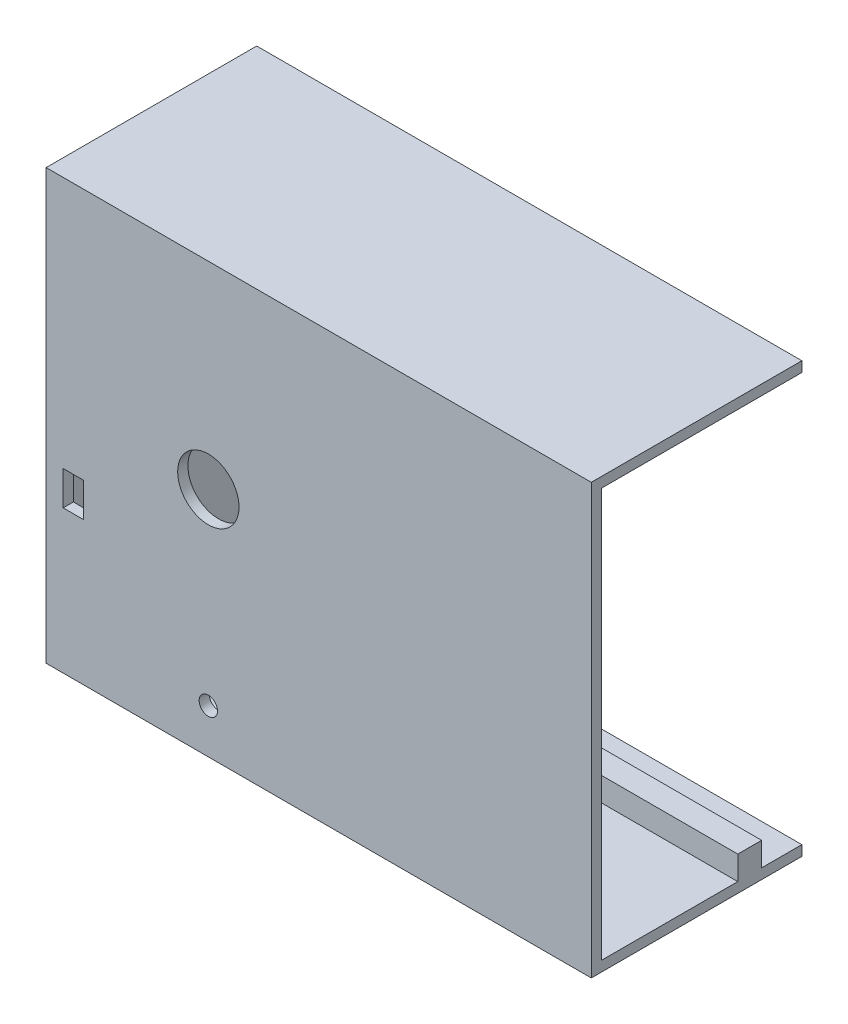
ISO-10303-21;
HEADER;
FILE_DESCRIPTION(('STEP AP214'),'2;1');
FILE_NAME('part.step','',(''),(''),'','','');
FILE_SCHEMA(('AUTOMOTIVE_DESIGN { 1 0 10303 214 1 1 1 1 }'));
ENDSEC;
DATA;
#1=APPLICATION_CONTEXT('core data for automotive mechanical design processes');
#2=APPLICATION_PROTOCOL_DEFINITION('international standard','automotive_design',2000,#1);
#3=PRODUCT_CONTEXT('',#1,'mechanical');
#4=PRODUCT('Part','Part','',(#3));
#5=PRODUCT_RELATED_PRODUCT_CATEGORY('part','',(#4));
#6=PRODUCT_DEFINITION_FORMATION('','',#4);
#7=PRODUCT_DEFINITION_CONTEXT('part definition',#1,'design');
#8=PRODUCT_DEFINITION('design','',#6,#7);
#9=PRODUCT_DEFINITION_SHAPE('','',#8);
#10=(LENGTH_UNIT() NAMED_UNIT(*) SI_UNIT(.MILLI.,.METRE.));
#11=(NAMED_UNIT(*) PLANE_ANGLE_UNIT() SI_UNIT($,.RADIAN.));
#12=(NAMED_UNIT(*) SI_UNIT($,.STERADIAN.) SOLID_ANGLE_UNIT());
#13=UNCERTAINTY_MEASURE_WITH_UNIT(LENGTH_MEASURE(1.E-05),#10,'distance_accuracy_value','');
#14=(GEOMETRIC_REPRESENTATION_CONTEXT(3) GLOBAL_UNCERTAINTY_ASSIGNED_CONTEXT((#13)) GLOBAL_UNIT_ASSIGNED_CONTEXT((#10,
#11,#12)) REPRESENTATION_CONTEXT('',''));
#15=CARTESIAN_POINT('',(0.,0.,0.));
#16=DIRECTION('',(0.,0.,1.));
#17=DIRECTION('',(1.,0.,0.));
#18=AXIS2_PLACEMENT_3D('',#15,#16,#17);
#19=CARTESIAN_POINT('',(0.,0.,0.));
#20=DIRECTION('',(1.,0.,0.));
#21=DIRECTION('',(0.,0.,-1.));
#22=AXIS2_PLACEMENT_3D('',#19,#20,#21);
#23=PLANE('',#22);
#24=DIRECTION('',(0.,0.,-1.));
#25=VECTOR('',#24,1.);
#26=CARTESIAN_POINT('',(0.,76.2,-156.21));
#27=LINE('',#26,#25);
#28=CARTESIAN_POINT('',(0.,76.2,-81.534));
#29=VERTEX_POINT('',#28);
#30=CARTESIAN_POINT('',(0.,76.2,-156.21));
#31=VERTEX_POINT('',#30);
#32=EDGE_CURVE('E266',#29,#31,#27,.T.);
#33=ORIENTED_EDGE('',*,*,#32,.T.);
#34=DIRECTION('',(0.,1.,0.));
#35=VECTOR('',#34,1.);
#36=CARTESIAN_POINT('',(0.,0.,-156.21));
#37=LINE('',#36,#35);
#38=CARTESIAN_POINT('',(0.,80.01,-156.21));
#39=VERTEX_POINT('',#38);
#40=EDGE_CURVE('E270',#31,#39,#37,.T.);
#41=ORIENTED_EDGE('',*,*,#40,.T.);
#42=DIRECTION('',(0.,0.,1.));
#43=VECTOR('',#42,1.);
#44=CARTESIAN_POINT('',(0.,80.01,80.01));
#45=LINE('',#44,#43);
#46=CARTESIAN_POINT('',(0.,80.01,-77.724));
#47=VERTEX_POINT('',#46);
#48=EDGE_CURVE('E274',#39,#47,#45,.T.);
#49=ORIENTED_EDGE('',*,*,#48,.T.);
#50=DIRECTION('',(0.,-1.,0.));
#51=VECTOR('',#50,1.);
#52=CARTESIAN_POINT('',(0.,0.,-77.724));
#53=LINE('',#52,#51);
#54=CARTESIAN_POINT('',(0.,-80.01,-77.724));
#55=VERTEX_POINT('',#54);
#56=EDGE_CURVE('E262',#47,#55,#53,.T.);
#57=ORIENTED_EDGE('',*,*,#56,.T.);
#58=DIRECTION('',(0.,0.,-1.));
#59=VECTOR('',#58,1.);
#60=CARTESIAN_POINT('',(0.,-80.01,80.01));
#61=LINE('',#60,#59);
#62=CARTESIAN_POINT('',(0.,-80.01,-156.21));
#63=VERTEX_POINT('',#62);
#64=EDGE_CURVE('E204',#55,#63,#61,.T.);
#65=ORIENTED_EDGE('',*,*,#64,.T.);
#66=CARTESIAN_POINT('',(0.,-76.2,-156.21));
#67=VERTEX_POINT('',#66);
#68=EDGE_CURVE('E269',#63,#67,#37,.T.);
#69=ORIENTED_EDGE('',*,*,#68,.T.);
#70=DIRECTION('',(0.,0.,1.));
#71=VECTOR('',#70,1.);
#72=CARTESIAN_POINT('',(0.,-76.2,-81.534));
#73=LINE('',#72,#71);
#74=CARTESIAN_POINT('',(0.,-76.2,-141.224));
#75=VERTEX_POINT('',#74);
#76=EDGE_CURVE('E196',#67,#75,#73,.T.);
#77=ORIENTED_EDGE('',*,*,#76,.T.);
#78=DIRECTION('',(0.,1.,0.));
#79=VECTOR('',#78,1.);
#80=CARTESIAN_POINT('',(0.,-50.8,-141.224));
#81=LINE('',#80,#79);
#82=CARTESIAN_POINT('',(0.,-67.31,-141.224));
#83=VERTEX_POINT('',#82);
#84=EDGE_CURVE('E201',#75,#83,#81,.T.);
#85=ORIENTED_EDGE('',*,*,#84,.T.);
#86=DIRECTION('',(0.,0.,-1.));
#87=VECTOR('',#86,1.);
#88=CARTESIAN_POINT('',(0.,-67.31,0.));
#89=LINE('',#88,#87);
#90=CARTESIAN_POINT('',(0.,-67.31,-132.334));
#91=VERTEX_POINT('',#90);
#92=EDGE_CURVE('E195',#91,#83,#89,.T.);
#93=ORIENTED_EDGE('',*,*,#92,.F.);
#94=DIRECTION('',(0.,-1.,0.));
#95=VECTOR('',#94,1.);
#96=CARTESIAN_POINT('',(0.,-67.31,-132.334));
#97=LINE('',#96,#95);
#98=CARTESIAN_POINT('',(0.,-76.2,-132.334));
#99=VERTEX_POINT('',#98);
#100=EDGE_CURVE('E181',#91,#99,#97,.T.);
#101=ORIENTED_EDGE('',*,*,#100,.T.);
#102=DIRECTION('',(0.,0.,1.));
#103=VECTOR('',#102,1.);
#104=CARTESIAN_POINT('',(0.,-76.2,-81.534));
#105=LINE('',#104,#103);
#106=CARTESIAN_POINT('',(0.,-76.2,-81.534));
#107=VERTEX_POINT('',#106);
#108=EDGE_CURVE('E187',#99,#107,#105,.T.);
#109=ORIENTED_EDGE('',*,*,#108,.T.);
#110=DIRECTION('',(0.,1.,0.));
#111=VECTOR('',#110,1.);
#112=CARTESIAN_POINT('',(0.,76.2,-81.534));
#113=LINE('',#112,#111);
#114=EDGE_CURVE('E259',#107,#29,#113,.T.);
#115=ORIENTED_EDGE('',*,*,#114,.T.);
#116=EDGE_LOOP('',(#33,#41,#49,#57,#65,#69,#77,#85,#93,#101,#109,#115));
#117=FACE_BOUND('',#116,.T.);
#118=ADVANCED_FACE('F45',(#117),#23,.T.);
#119=CARTESIAN_POINT('',(-142.748,-63.5,-156.211));
#120=DIRECTION('',(0.,0.,1.));
#121=DIRECTION('',(1.,0.,0.));
#122=AXIS2_PLACEMENT_3D('',#119,#120,#121);
#123=CYLINDRICAL_SURFACE('',#122,3.429);
#124=CARTESIAN_POINT('',(-142.748,-63.5,-77.724));
#125=DIRECTION('',(0.,0.,1.));
#126=DIRECTION('',(1.,0.,0.));
#127=AXIS2_PLACEMENT_3D('',#124,#125,#126);
#128=CIRCLE('',#127,3.429);
#129=CARTESIAN_POINT('',(-139.319,-63.5,-77.724));
#130=VERTEX_POINT('',#129);
#131=EDGE_CURVE('E382',#130,#130,#128,.T.);
#132=ORIENTED_EDGE('',*,*,#131,.T.);
#133=EDGE_LOOP('',(#132));
#134=FACE_BOUND('',#133,.T.);
#135=CARTESIAN_POINT('',(-142.748,-63.5,-81.534));
#136=DIRECTION('',(0.,0.,1.));
#137=DIRECTION('',(1.,0.,0.));
#138=AXIS2_PLACEMENT_3D('',#135,#136,#137);
#139=CIRCLE('',#138,3.429);
#140=CARTESIAN_POINT('',(-139.319,-63.5,-81.534));
#141=VERTEX_POINT('',#140);
#142=EDGE_CURVE('E378',#141,#141,#139,.F.);
#143=ORIENTED_EDGE('',*,*,#142,.T.);
#144=EDGE_LOOP('',(#143));
#145=FACE_BOUND('',#144,.T.);
#146=ADVANCED_FACE('F456',(#134,#145),#123,.F.);
#147=CARTESIAN_POINT('',(-196.85,-13.97,-156.211));
#148=DIRECTION('',(0.,-1.,0.));
#149=DIRECTION('',(1.,0.,0.));
#150=AXIS2_PLACEMENT_3D('',#147,#148,#149);
#151=PLANE('',#150);
#152=DIRECTION('',(0.,0.,1.));
#153=VECTOR('',#152,1.);
#154=CARTESIAN_POINT('',(-189.23,-13.97,-156.211));
#155=LINE('',#154,#153);
#156=CARTESIAN_POINT('',(-189.23,-13.97,-81.534));
#157=VERTEX_POINT('',#156);
#158=CARTESIAN_POINT('',(-189.23,-13.97,-77.724));
#159=VERTEX_POINT('',#158);
#160=EDGE_CURVE('E338',#157,#159,#155,.T.);
#161=ORIENTED_EDGE('',*,*,#160,.T.);
#162=DIRECTION('',(1.,0.,0.));
#163=VECTOR('',#162,1.);
#164=CARTESIAN_POINT('',(-196.85,-13.97,-77.724));
#165=LINE('',#164,#163);
#166=CARTESIAN_POINT('',(-196.85,-13.97,-77.724));
#167=VERTEX_POINT('',#166);
#168=EDGE_CURVE('E350',#167,#159,#165,.T.);
#169=ORIENTED_EDGE('',*,*,#168,.F.);
#170=DIRECTION('',(0.,0.,1.));
#171=VECTOR('',#170,1.);
#172=CARTESIAN_POINT('',(-196.85,-13.97,-156.211));
#173=LINE('',#172,#171);
#174=CARTESIAN_POINT('',(-196.85,-13.97,-81.534));
#175=VERTEX_POINT('',#174);
#176=EDGE_CURVE('E335',#175,#167,#173,.T.);
#177=ORIENTED_EDGE('',*,*,#176,.F.);
#178=DIRECTION('',(-1.,0.,0.));
#179=VECTOR('',#178,1.);
#180=CARTESIAN_POINT('',(-196.85,-13.97,-81.534));
#181=LINE('',#180,#179);
#182=EDGE_CURVE('E325',#157,#175,#181,.T.);
#183=ORIENTED_EDGE('',*,*,#182,.F.);
#184=EDGE_LOOP('',(#161,#169,#177,#183));
#185=FACE_BOUND('',#184,.T.);
#186=ADVANCED_FACE('F458',(#185),#151,.T.);
#187=CARTESIAN_POINT('',(-196.85,-26.67,-156.211));
#188=DIRECTION('',(1.,0.,0.));
#189=DIRECTION('',(0.,0.,-1.));
#190=AXIS2_PLACEMENT_3D('',#187,#188,#189);
#191=PLANE('',#190);
#192=ORIENTED_EDGE('',*,*,#176,.T.);
#193=DIRECTION('',(0.,1.,0.));
#194=VECTOR('',#193,1.);
#195=CARTESIAN_POINT('',(-196.85,-26.67,-77.724));
#196=LINE('',#195,#194);
#197=CARTESIAN_POINT('',(-196.85,-26.67,-77.724));
#198=VERTEX_POINT('',#197);
#199=EDGE_CURVE('E346',#198,#167,#196,.T.);
#200=ORIENTED_EDGE('',*,*,#199,.F.);
#201=DIRECTION('',(0.,0.,1.));
#202=VECTOR('',#201,1.);
#203=CARTESIAN_POINT('',(-196.85,-26.67,-156.211));
#204=LINE('',#203,#202);
#205=CARTESIAN_POINT('',(-196.85,-26.67,-81.534));
#206=VERTEX_POINT('',#205);
#207=EDGE_CURVE('E332',#206,#198,#204,.T.);
#208=ORIENTED_EDGE('',*,*,#207,.F.);
#209=DIRECTION('',(0.,-1.,0.));
#210=VECTOR('',#209,1.);
#211=CARTESIAN_POINT('',(-196.85,-26.67,-81.534));
#212=LINE('',#211,#210);
#213=EDGE_CURVE('E366',#175,#206,#212,.T.);
#214=ORIENTED_EDGE('',*,*,#213,.F.);
#215=EDGE_LOOP('',(#192,#200,#208,#214));
#216=FACE_BOUND('',#215,.T.);
#217=ADVANCED_FACE('F465',(#216),#191,.T.);
#218=CARTESIAN_POINT('',(-196.85,-26.67,-156.211));
#219=DIRECTION('',(0.,1.,0.));
#220=DIRECTION('',(0.,0.,1.));
#221=AXIS2_PLACEMENT_3D('',#218,#219,#220);
#222=PLANE('',#221);
#223=ORIENTED_EDGE('',*,*,#207,.T.);
#224=DIRECTION('',(-1.,0.,0.));
#225=VECTOR('',#224,1.);
#226=CARTESIAN_POINT('',(-196.85,-26.67,-77.724));
#227=LINE('',#226,#225);
#228=CARTESIAN_POINT('',(-189.23,-26.67,-77.724));
#229=VERTEX_POINT('',#228);
#230=EDGE_CURVE('E342',#229,#198,#227,.T.);
#231=ORIENTED_EDGE('',*,*,#230,.F.);
#232=DIRECTION('',(0.,0.,1.));
#233=VECTOR('',#232,1.);
#234=CARTESIAN_POINT('',(-189.23,-26.67,-156.211));
#235=LINE('',#234,#233);
#236=CARTESIAN_POINT('',(-189.23,-26.67,-81.534));
#237=VERTEX_POINT('',#236);
#238=EDGE_CURVE('E329',#237,#229,#235,.T.);
#239=ORIENTED_EDGE('',*,*,#238,.F.);
#240=DIRECTION('',(1.,0.,0.));
#241=VECTOR('',#240,1.);
#242=CARTESIAN_POINT('',(-196.85,-26.67,-81.534));
#243=LINE('',#242,#241);
#244=EDGE_CURVE('E362',#206,#237,#243,.T.);
#245=ORIENTED_EDGE('',*,*,#244,.F.);
#246=EDGE_LOOP('',(#223,#231,#239,#245));
#247=FACE_BOUND('',#246,.T.);
#248=ADVANCED_FACE('F472',(#247),#222,.T.);
#249=CARTESIAN_POINT('',(-189.23,-26.67,-156.211));
#250=DIRECTION('',(-1.,0.,0.));
#251=DIRECTION('',(0.,0.,1.));
#252=AXIS2_PLACEMENT_3D('',#249,#250,#251);
#253=PLANE('',#252);
#254=ORIENTED_EDGE('',*,*,#238,.T.);
#255=DIRECTION('',(0.,-1.,0.));
#256=VECTOR('',#255,1.);
#257=CARTESIAN_POINT('',(-189.23,-26.67,-77.724));
#258=LINE('',#257,#256);
#259=EDGE_CURVE('E354',#159,#229,#258,.T.);
#260=ORIENTED_EDGE('',*,*,#259,.F.);
#261=ORIENTED_EDGE('',*,*,#160,.F.);
#262=DIRECTION('',(0.,1.,0.));
#263=VECTOR('',#262,1.);
#264=CARTESIAN_POINT('',(-189.23,-26.67,-81.534));
#265=LINE('',#264,#263);
#266=EDGE_CURVE('E358',#237,#157,#265,.T.);
#267=ORIENTED_EDGE('',*,*,#266,.F.);
#268=EDGE_LOOP('',(#254,#260,#261,#267));
#269=FACE_BOUND('',#268,.T.);
#270=ADVANCED_FACE('F505',(#269),#253,.T.);
#271=CARTESIAN_POINT('',(-142.748,6.34999999999999,-156.211));
#272=DIRECTION('',(0.,0.,1.));
#273=DIRECTION('',(1.,0.,0.));
#274=AXIS2_PLACEMENT_3D('',#271,#272,#273);
#275=CYLINDRICAL_SURFACE('',#274,11.43);
#276=CARTESIAN_POINT('',(-142.748,6.34999999999999,-77.724));
#277=DIRECTION('',(0.,0.,-1.));
#278=DIRECTION('',(-1.,0.,0.));
#279=AXIS2_PLACEMENT_3D('',#276,#277,#278);
#280=CIRCLE('',#279,11.43);
#281=CARTESIAN_POINT('',(-154.178,6.34999999999999,-77.724));
#282=VERTEX_POINT('',#281);
#283=EDGE_CURVE('E370',#282,#282,#280,.T.);
#284=ORIENTED_EDGE('',*,*,#283,.F.);
#285=EDGE_LOOP('',(#284));
#286=FACE_BOUND('',#285,.T.);
#287=CARTESIAN_POINT('',(-142.748,6.34999999999999,-81.534));
#288=DIRECTION('',(0.,0.,1.));
#289=DIRECTION('',(1.,0.,0.));
#290=AXIS2_PLACEMENT_3D('',#287,#288,#289);
#291=CIRCLE('',#290,11.43);
#292=CARTESIAN_POINT('',(-131.318,6.34999999999999,-81.534));
#293=VERTEX_POINT('',#292);
#294=EDGE_CURVE('E374',#293,#293,#291,.T.);
#295=ORIENTED_EDGE('',*,*,#294,.F.);
#296=EDGE_LOOP('',(#295));
#297=FACE_BOUND('',#296,.T.);
#298=ADVANCED_FACE('F483',(#286,#297),#275,.F.);
#299=CARTESIAN_POINT('',(-200.025,76.2,-81.534));
#300=DIRECTION('',(0.,0.,1.));
#301=DIRECTION('',(1.,0.,0.));
#302=AXIS2_PLACEMENT_3D('',#299,#300,#301);
#303=PLANE('',#302);
#304=ORIENTED_EDGE('',*,*,#142,.F.);
#305=EDGE_LOOP('',(#304));
#306=FACE_BOUND('',#305,.T.);
#307=ORIENTED_EDGE('',*,*,#266,.T.);
#308=ORIENTED_EDGE('',*,*,#182,.T.);
#309=ORIENTED_EDGE('',*,*,#213,.T.);
#310=ORIENTED_EDGE('',*,*,#244,.T.);
#311=EDGE_LOOP('',(#307,#308,#309,#310));
#312=FACE_BOUND('',#311,.T.);
#313=ORIENTED_EDGE('',*,*,#294,.T.);
#314=EDGE_LOOP('',(#313));
#315=FACE_BOUND('',#314,.T.);
#316=ORIENTED_EDGE('',*,*,#114,.F.);
#317=DIRECTION('',(1.,0.,0.));
#318=VECTOR('',#317,1.);
#319=CARTESIAN_POINT('',(-200.025,-76.2,-81.534));
#320=LINE('',#319,#318);
#321=CARTESIAN_POINT('',(-63.5000000000001,-76.2,-81.534));
#322=VERTEX_POINT('',#321);
#323=EDGE_CURVE('E190',#322,#107,#320,.T.);
#324=ORIENTED_EDGE('',*,*,#323,.F.);
#325=DIRECTION('',(0.,-1.,0.));
#326=VECTOR('',#325,1.);
#327=CARTESIAN_POINT('',(-63.5,76.2,-81.534));
#328=LINE('',#327,#326);
#329=CARTESIAN_POINT('',(-63.5,-50.8,-81.534));
#330=VERTEX_POINT('',#329);
#331=EDGE_CURVE('E386',#330,#322,#328,.T.);
#332=ORIENTED_EDGE('',*,*,#331,.F.);
#333=DIRECTION('',(1.,0.,0.));
#334=VECTOR('',#333,1.);
#335=CARTESIAN_POINT('',(-200.025,-50.8,-81.534));
#336=LINE('',#335,#334);
#337=CARTESIAN_POINT('',(-71.12,-50.8,-81.534));
#338=VERTEX_POINT('',#337);
#339=EDGE_CURVE('E254',#338,#330,#336,.T.);
#340=ORIENTED_EDGE('',*,*,#339,.F.);
#341=DIRECTION('',(0.,1.,0.));
#342=VECTOR('',#341,1.);
#343=CARTESIAN_POINT('',(-71.12,76.2,-81.534));
#344=LINE('',#343,#342);
#345=CARTESIAN_POINT('',(-71.12,-76.2,-81.534));
#346=VERTEX_POINT('',#345);
#347=EDGE_CURVE('E390',#346,#338,#344,.T.);
#348=ORIENTED_EDGE('',*,*,#347,.F.);
#349=CARTESIAN_POINT('',(-200.025,-76.2,-81.534));
#350=VERTEX_POINT('',#349);
#351=EDGE_CURVE('E230',#350,#346,#320,.T.);
#352=ORIENTED_EDGE('',*,*,#351,.F.);
#353=DIRECTION('',(0.,-1.,0.));
#354=VECTOR('',#353,1.);
#355=CARTESIAN_POINT('',(-200.025,76.2,-81.534));
#356=LINE('',#355,#354);
#357=CARTESIAN_POINT('',(-200.025,76.2,-81.534));
#358=VERTEX_POINT('',#357);
#359=EDGE_CURVE('E317',#358,#350,#356,.T.);
#360=ORIENTED_EDGE('',*,*,#359,.F.);
#361=DIRECTION('',(1.,0.,0.));
#362=VECTOR('',#361,1.);
#363=CARTESIAN_POINT('',(-200.025,76.2,-81.534));
#364=LINE('',#363,#362);
#365=EDGE_CURVE('E233',#358,#29,#364,.T.);
#366=ORIENTED_EDGE('',*,*,#365,.T.);
#367=EDGE_LOOP('',(#316,#324,#332,#340,#348,#352,#360,#366));
#368=FACE_BOUND('',#367,.T.);
#369=ADVANCED_FACE('F422',(#306,#312,#315,#368),#303,.F.);
#370=CARTESIAN_POINT('',(0.,-50.8,0.));
#371=DIRECTION('',(0.,-1.,0.));
#372=DIRECTION('',(0.,0.,-1.));
#373=AXIS2_PLACEMENT_3D('',#370,#371,#372);
#374=PLANE('',#373);
#375=DIRECTION('',(0.,0.,1.));
#376=VECTOR('',#375,1.);
#377=CARTESIAN_POINT('',(-71.12,-50.8,-141.224));
#378=LINE('',#377,#376);
#379=CARTESIAN_POINT('',(-71.12,-50.8,-141.224));
#380=VERTEX_POINT('',#379);
#381=EDGE_CURVE('E402',#380,#338,#378,.T.);
#382=ORIENTED_EDGE('',*,*,#381,.T.);
#383=ORIENTED_EDGE('',*,*,#339,.T.);
#384=DIRECTION('',(0.,0.,-1.));
#385=VECTOR('',#384,1.);
#386=CARTESIAN_POINT('',(-63.5,-50.8,-141.224));
#387=LINE('',#386,#385);
#388=CARTESIAN_POINT('',(-63.5,-50.8,-141.224));
#389=VERTEX_POINT('',#388);
#390=EDGE_CURVE('E61',#330,#389,#387,.T.);
#391=ORIENTED_EDGE('',*,*,#390,.T.);
#392=DIRECTION('',(-1.,0.,0.));
#393=VECTOR('',#392,1.);
#394=CARTESIAN_POINT('',(-63.5,-50.8,-141.224));
#395=LINE('',#394,#393);
#396=EDGE_CURVE('E66',#389,#380,#395,.T.);
#397=ORIENTED_EDGE('',*,*,#396,.T.);
#398=EDGE_LOOP('',(#382,#383,#391,#397));
#399=FACE_BOUND('',#398,.T.);
#400=ADVANCED_FACE('F423',(#399),#374,.F.);
#401=CARTESIAN_POINT('',(-71.12,-50.8,-141.224));
#402=DIRECTION('',(1.,0.,0.));
#403=DIRECTION('',(0.,0.,-1.));
#404=AXIS2_PLACEMENT_3D('',#401,#402,#403);
#405=PLANE('',#404);
#406=DIRECTION('',(0.,0.,1.));
#407=VECTOR('',#406,1.);
#408=CARTESIAN_POINT('',(-71.12,-76.2,-141.224));
#409=LINE('',#408,#407);
#410=CARTESIAN_POINT('',(-71.12,-76.2,-141.224));
#411=VERTEX_POINT('',#410);
#412=EDGE_CURVE('E240',#411,#346,#409,.T.);
#413=ORIENTED_EDGE('',*,*,#412,.T.);
#414=ORIENTED_EDGE('',*,*,#347,.T.);
#415=ORIENTED_EDGE('',*,*,#381,.F.);
#416=DIRECTION('',(0.,-1.,0.));
#417=VECTOR('',#416,1.);
#418=CARTESIAN_POINT('',(-71.12,-50.8,-141.224));
#419=LINE('',#418,#417);
#420=EDGE_CURVE('E398',#380,#411,#419,.T.);
#421=ORIENTED_EDGE('',*,*,#420,.T.);
#422=EDGE_LOOP('',(#413,#414,#415,#421));
#423=FACE_BOUND('',#422,.T.);
#424=ADVANCED_FACE('F414',(#423),#405,.F.);
#425=CARTESIAN_POINT('',(-200.025,-76.2,-81.534));
#426=DIRECTION('',(0.,-1.,0.));
#427=DIRECTION('',(0.,0.,-1.));
#428=AXIS2_PLACEMENT_3D('',#425,#426,#427);
#429=PLANE('',#428);
#430=ORIENTED_EDGE('',*,*,#76,.F.);
#431=DIRECTION('',(1.,0.,0.));
#432=VECTOR('',#431,1.);
#433=CARTESIAN_POINT('',(-200.025,-76.2,-156.21));
#434=LINE('',#433,#432);
#435=CARTESIAN_POINT('',(-200.025,-76.2,-156.21));
#436=VERTEX_POINT('',#435);
#437=EDGE_CURVE('E227',#436,#67,#434,.T.);
#438=ORIENTED_EDGE('',*,*,#437,.F.);
#439=DIRECTION('',(0.,0.,-1.));
#440=VECTOR('',#439,1.);
#441=CARTESIAN_POINT('',(-200.025,-76.2,-81.534));
#442=LINE('',#441,#440);
#443=EDGE_CURVE('E313',#350,#436,#442,.T.);
#444=ORIENTED_EDGE('',*,*,#443,.F.);
#445=ORIENTED_EDGE('',*,*,#351,.T.);
#446=ORIENTED_EDGE('',*,*,#412,.F.);
#447=DIRECTION('',(-1.,0.,0.));
#448=VECTOR('',#447,1.);
#449=CARTESIAN_POINT('',(-63.5,-76.2,-141.224));
#450=LINE('',#449,#448);
#451=EDGE_CURVE('E237',#75,#411,#450,.T.);
#452=ORIENTED_EDGE('',*,*,#451,.F.);
#453=EDGE_LOOP('',(#430,#438,#444,#445,#446,#452));
#454=FACE_BOUND('',#453,.T.);
#455=ADVANCED_FACE('F418',(#454),#429,.F.);
#456=ORIENTED_EDGE('',*,*,#108,.F.);
#457=DIRECTION('',(1.,0.,0.));
#458=VECTOR('',#457,1.);
#459=CARTESIAN_POINT('',(-63.5000000000001,-76.2,-132.334));
#460=LINE('',#459,#458);
#461=CARTESIAN_POINT('',(-63.5,-76.2,-132.334));
#462=VERTEX_POINT('',#461);
#463=EDGE_CURVE('E11',#462,#99,#460,.T.);
#464=ORIENTED_EDGE('',*,*,#463,.F.);
#465=DIRECTION('',(0.,0.,-1.));
#466=VECTOR('',#465,1.);
#467=CARTESIAN_POINT('',(-63.5,-76.2,-81.534));
#468=LINE('',#467,#466);
#469=EDGE_CURVE('E212',#322,#462,#468,.T.);
#470=ORIENTED_EDGE('',*,*,#469,.F.);
#471=ORIENTED_EDGE('',*,*,#323,.T.);
#472=EDGE_LOOP('',(#456,#464,#470,#471));
#473=FACE_BOUND('',#472,.T.);
#474=ADVANCED_FACE('F188',(#473),#429,.F.);
#475=CARTESIAN_POINT('',(-63.5,-50.8,-141.224));
#476=DIRECTION('',(-1.,0.,0.));
#477=DIRECTION('',(0.,0.,1.));
#478=AXIS2_PLACEMENT_3D('',#475,#476,#477);
#479=PLANE('',#478);
#480=DIRECTION('',(0.,-1.,0.));
#481=VECTOR('',#480,1.);
#482=CARTESIAN_POINT('',(-63.5000000000001,-67.31,-132.334));
#483=LINE('',#482,#481);
#484=CARTESIAN_POINT('',(-63.5,-67.31,-132.334));
#485=VERTEX_POINT('',#484);
#486=EDGE_CURVE('E183',#485,#462,#483,.T.);
#487=ORIENTED_EDGE('',*,*,#486,.F.);
#488=DIRECTION('',(0.,0.,1.));
#489=VECTOR('',#488,1.);
#490=CARTESIAN_POINT('',(-63.5000000000001,-67.31,-141.224));
#491=LINE('',#490,#489);
#492=CARTESIAN_POINT('',(-63.5,-67.31,-141.224));
#493=VERTEX_POINT('',#492);
#494=EDGE_CURVE('E54',#493,#485,#491,.T.);
#495=ORIENTED_EDGE('',*,*,#494,.F.);
#496=DIRECTION('',(0.,-1.,0.));
#497=VECTOR('',#496,1.);
#498=CARTESIAN_POINT('',(-63.5,-50.8,-141.224));
#499=LINE('',#498,#497);
#500=EDGE_CURVE('E394',#389,#493,#499,.T.);
#501=ORIENTED_EDGE('',*,*,#500,.F.);
#502=ORIENTED_EDGE('',*,*,#390,.F.);
#503=ORIENTED_EDGE('',*,*,#331,.T.);
#504=ORIENTED_EDGE('',*,*,#469,.T.);
#505=EDGE_LOOP('',(#487,#495,#501,#502,#503,#504));
#506=FACE_BOUND('',#505,.T.);
#507=ADVANCED_FACE('F425',(#506),#479,.F.);
#508=CARTESIAN_POINT('',(-63.5,-50.8,-141.224));
#509=DIRECTION('',(0.,0.,1.));
#510=DIRECTION('',(0.,-1.,0.));
#511=AXIS2_PLACEMENT_3D('',#508,#509,#510);
#512=PLANE('',#511);
#513=ORIENTED_EDGE('',*,*,#84,.F.);
#514=ORIENTED_EDGE('',*,*,#451,.T.);
#515=ORIENTED_EDGE('',*,*,#420,.F.);
#516=ORIENTED_EDGE('',*,*,#396,.F.);
#517=ORIENTED_EDGE('',*,*,#500,.T.);
#518=DIRECTION('',(-1.,0.,0.));
#519=VECTOR('',#518,1.);
#520=CARTESIAN_POINT('',(-63.5000000000001,-67.31,-141.224));
#521=LINE('',#520,#519);
#522=EDGE_CURVE('E241',#83,#493,#521,.T.);
#523=ORIENTED_EDGE('',*,*,#522,.F.);
#524=EDGE_LOOP('',(#513,#514,#515,#516,#517,#523));
#525=FACE_BOUND('',#524,.T.);
#526=ADVANCED_FACE('F429',(#525),#512,.F.);
#527=CARTESIAN_POINT('',(-63.5000000000001,-67.31,-132.334));
#528=DIRECTION('',(0.,0.,-1.));
#529=DIRECTION('',(0.,1.,0.));
#530=AXIS2_PLACEMENT_3D('',#527,#528,#529);
#531=PLANE('',#530);
#532=ORIENTED_EDGE('',*,*,#100,.F.);
#533=DIRECTION('',(1.,0.,0.));
#534=VECTOR('',#533,1.);
#535=CARTESIAN_POINT('',(-63.5000000000001,-67.31,-132.334));
#536=LINE('',#535,#534);
#537=EDGE_CURVE('E243',#485,#91,#536,.T.);
#538=ORIENTED_EDGE('',*,*,#537,.F.);
#539=ORIENTED_EDGE('',*,*,#486,.T.);
#540=ORIENTED_EDGE('',*,*,#463,.T.);
#541=EDGE_LOOP('',(#532,#538,#539,#540));
#542=FACE_BOUND('',#541,.T.);
#543=ADVANCED_FACE('F178',(#542),#531,.F.);
#544=CARTESIAN_POINT('',(0.,-67.31,0.));
#545=DIRECTION('',(0.,1.,0.));
#546=DIRECTION('',(0.,0.,1.));
#547=AXIS2_PLACEMENT_3D('',#544,#545,#546);
#548=PLANE('',#547);
#549=ORIENTED_EDGE('',*,*,#537,.T.);
#550=ORIENTED_EDGE('',*,*,#92,.T.);
#551=ORIENTED_EDGE('',*,*,#522,.T.);
#552=ORIENTED_EDGE('',*,*,#494,.T.);
#553=EDGE_LOOP('',(#549,#550,#551,#552));
#554=FACE_BOUND('',#553,.T.);
#555=ADVANCED_FACE('F47',(#554),#548,.T.);
#556=CARTESIAN_POINT('',(-200.025,0.,0.));
#557=DIRECTION('',(1.,0.,0.));
#558=DIRECTION('',(0.,0.,-1.));
#559=AXIS2_PLACEMENT_3D('',#556,#557,#558);
#560=PLANE('',#559);
#561=DIRECTION('',(0.,0.,1.));
#562=VECTOR('',#561,1.);
#563=CARTESIAN_POINT('',(-200.025,76.2,-156.21));
#564=LINE('',#563,#562);
#565=CARTESIAN_POINT('',(-200.025,76.2,-156.21));
#566=VERTEX_POINT('',#565);
#567=EDGE_CURVE('E321',#566,#358,#564,.T.);
#568=ORIENTED_EDGE('',*,*,#567,.T.);
#569=ORIENTED_EDGE('',*,*,#359,.T.);
#570=ORIENTED_EDGE('',*,*,#443,.T.);
#571=DIRECTION('',(0.,1.,0.));
#572=VECTOR('',#571,1.);
#573=CARTESIAN_POINT('',(-200.025,-76.2,-156.21));
#574=LINE('',#573,#572);
#575=EDGE_CURVE('E236',#436,#566,#574,.T.);
#576=ORIENTED_EDGE('',*,*,#575,.T.);
#577=EDGE_LOOP('',(#568,#569,#570,#576));
#578=FACE_BOUND('',#577,.T.);
#579=ADVANCED_FACE('F431',(#578),#560,.T.);
#580=CARTESIAN_POINT('',(-200.025,76.2,-156.21));
#581=DIRECTION('',(0.,1.,0.));
#582=DIRECTION('',(0.,0.,1.));
#583=AXIS2_PLACEMENT_3D('',#580,#581,#582);
#584=PLANE('',#583);
#585=ORIENTED_EDGE('',*,*,#32,.F.);
#586=ORIENTED_EDGE('',*,*,#365,.F.);
#587=ORIENTED_EDGE('',*,*,#567,.F.);
#588=DIRECTION('',(1.,0.,0.));
#589=VECTOR('',#588,1.);
#590=CARTESIAN_POINT('',(-200.025,76.2,-156.21));
#591=LINE('',#590,#589);
#592=EDGE_CURVE('E224',#566,#31,#591,.T.);
#593=ORIENTED_EDGE('',*,*,#592,.T.);
#594=EDGE_LOOP('',(#585,#586,#587,#593));
#595=FACE_BOUND('',#594,.T.);
#596=ADVANCED_FACE('F436',(#595),#584,.F.);
#597=CARTESIAN_POINT('',(0.,0.,-156.21));
#598=DIRECTION('',(0.,0.,1.));
#599=DIRECTION('',(0.,-1.,0.));
#600=AXIS2_PLACEMENT_3D('',#597,#598,#599);
#601=PLANE('',#600);
#602=ORIENTED_EDGE('',*,*,#68,.F.);
#603=DIRECTION('',(-1.,0.,0.));
#604=VECTOR('',#603,1.);
#605=CARTESIAN_POINT('',(203.2,-80.01,-156.21));
#606=LINE('',#605,#604);
#607=CARTESIAN_POINT('',(-203.2,-80.01,-156.21));
#608=VERTEX_POINT('',#607);
#609=EDGE_CURVE('E221',#63,#608,#606,.T.);
#610=ORIENTED_EDGE('',*,*,#609,.T.);
#611=DIRECTION('',(0.,1.,0.));
#612=VECTOR('',#611,1.);
#613=CARTESIAN_POINT('',(-203.2,-80.01,-156.21));
#614=LINE('',#613,#612);
#615=CARTESIAN_POINT('',(-203.2,80.01,-156.21));
#616=VERTEX_POINT('',#615);
#617=EDGE_CURVE('E219',#608,#616,#614,.T.);
#618=ORIENTED_EDGE('',*,*,#617,.T.);
#619=DIRECTION('',(1.,0.,0.));
#620=VECTOR('',#619,1.);
#621=CARTESIAN_POINT('',(203.2,80.01,-156.21));
#622=LINE('',#621,#620);
#623=EDGE_CURVE('E216',#616,#39,#622,.T.);
#624=ORIENTED_EDGE('',*,*,#623,.T.);
#625=ORIENTED_EDGE('',*,*,#40,.F.);
#626=ORIENTED_EDGE('',*,*,#592,.F.);
#627=ORIENTED_EDGE('',*,*,#575,.F.);
#628=ORIENTED_EDGE('',*,*,#437,.T.);
#629=EDGE_LOOP('',(#602,#610,#618,#624,#625,#626,#627,#628));
#630=FACE_BOUND('',#629,.T.);
#631=ADVANCED_FACE('F292',(#630),#601,.F.);
#632=CARTESIAN_POINT('',(-203.2,0.,0.));
#633=DIRECTION('',(1.,0.,0.));
#634=DIRECTION('',(0.,0.,-1.));
#635=AXIS2_PLACEMENT_3D('',#632,#633,#634);
#636=PLANE('',#635);
#637=DIRECTION('',(0.,0.,-1.));
#638=VECTOR('',#637,1.);
#639=CARTESIAN_POINT('',(-203.2,-80.01,80.01));
#640=LINE('',#639,#638);
#641=CARTESIAN_POINT('',(-203.2,-80.01,-77.724));
#642=VERTEX_POINT('',#641);
#643=EDGE_CURVE('E288',#642,#608,#640,.T.);
#644=ORIENTED_EDGE('',*,*,#643,.F.);
#645=DIRECTION('',(0.,1.,0.));
#646=VECTOR('',#645,1.);
#647=CARTESIAN_POINT('',(-203.2,0.,-77.724));
#648=LINE('',#647,#646);
#649=CARTESIAN_POINT('',(-203.2,80.01,-77.724));
#650=VERTEX_POINT('',#649);
#651=EDGE_CURVE('E215',#642,#650,#648,.T.);
#652=ORIENTED_EDGE('',*,*,#651,.T.);
#653=DIRECTION('',(0.,0.,1.));
#654=VECTOR('',#653,1.);
#655=CARTESIAN_POINT('',(-203.2,80.01,80.01));
#656=LINE('',#655,#654);
#657=EDGE_CURVE('E220',#616,#650,#656,.T.);
#658=ORIENTED_EDGE('',*,*,#657,.F.);
#659=ORIENTED_EDGE('',*,*,#617,.F.);
#660=EDGE_LOOP('',(#644,#652,#658,#659));
#661=FACE_BOUND('',#660,.T.);
#662=ADVANCED_FACE('F445',(#661),#636,.F.);
#663=CARTESIAN_POINT('',(0.,0.,-77.724));
#664=DIRECTION('',(0.,0.,-1.));
#665=DIRECTION('',(-1.,0.,0.));
#666=AXIS2_PLACEMENT_3D('',#663,#664,#665);
#667=PLANE('',#666);
#668=ORIENTED_EDGE('',*,*,#283,.T.);
#669=EDGE_LOOP('',(#668));
#670=FACE_BOUND('',#669,.T.);
#671=ORIENTED_EDGE('',*,*,#259,.T.);
#672=ORIENTED_EDGE('',*,*,#230,.T.);
#673=ORIENTED_EDGE('',*,*,#199,.T.);
#674=ORIENTED_EDGE('',*,*,#168,.T.);
#675=EDGE_LOOP('',(#671,#672,#673,#674));
#676=FACE_BOUND('',#675,.T.);
#677=ORIENTED_EDGE('',*,*,#131,.F.);
#678=EDGE_LOOP('',(#677));
#679=FACE_BOUND('',#678,.T.);
#680=ORIENTED_EDGE('',*,*,#56,.F.);
#681=DIRECTION('',(1.,0.,0.));
#682=VECTOR('',#681,1.);
#683=CARTESIAN_POINT('',(203.2,80.01,-77.724));
#684=LINE('',#683,#682);
#685=EDGE_CURVE('E208',#650,#47,#684,.T.);
#686=ORIENTED_EDGE('',*,*,#685,.F.);
#687=ORIENTED_EDGE('',*,*,#651,.F.);
#688=DIRECTION('',(-1.,0.,0.));
#689=VECTOR('',#688,1.);
#690=CARTESIAN_POINT('',(203.2,-80.01,-77.724));
#691=LINE('',#690,#689);
#692=EDGE_CURVE('E211',#55,#642,#691,.T.);
#693=ORIENTED_EDGE('',*,*,#692,.F.);
#694=EDGE_LOOP('',(#680,#686,#687,#693));
#695=FACE_BOUND('',#694,.T.);
#696=ADVANCED_FACE('F443',(#670,#676,#679,#695),#667,.F.);
#697=CARTESIAN_POINT('',(203.2,-80.01,80.01));
#698=DIRECTION('',(0.,1.,0.));
#699=DIRECTION('',(0.,0.,1.));
#700=AXIS2_PLACEMENT_3D('',#697,#698,#699);
#701=PLANE('',#700);
#702=ORIENTED_EDGE('',*,*,#64,.F.);
#703=ORIENTED_EDGE('',*,*,#692,.T.);
#704=ORIENTED_EDGE('',*,*,#643,.T.);
#705=ORIENTED_EDGE('',*,*,#609,.F.);
#706=EDGE_LOOP('',(#702,#703,#704,#705));
#707=FACE_BOUND('',#706,.T.);
#708=ADVANCED_FACE('F284',(#707),#701,.F.);
#709=CARTESIAN_POINT('',(203.2,80.01,80.01));
#710=DIRECTION('',(0.,-1.,0.));
#711=DIRECTION('',(0.,0.,-1.));
#712=AXIS2_PLACEMENT_3D('',#709,#710,#711);
#713=PLANE('',#712);
#714=ORIENTED_EDGE('',*,*,#48,.F.);
#715=ORIENTED_EDGE('',*,*,#623,.F.);
#716=ORIENTED_EDGE('',*,*,#657,.T.);
#717=ORIENTED_EDGE('',*,*,#685,.T.);
#718=EDGE_LOOP('',(#714,#715,#716,#717));
#719=FACE_BOUND('',#718,.T.);
#720=ADVANCED_FACE('F440',(#719),#713,.F.);
#721=CLOSED_SHELL('',(#118,#146,#186,#217,#248,#270,#298,#369,#400,#424,#455,#474,#507,#526,
#543,#555,#579,#596,#631,#662,#696,#708,#720));
#722=MANIFOLD_SOLID_BREP('B2',#721);
#723=ADVANCED_BREP_SHAPE_REPRESENTATION('',(#18,#722),#14);
#724=SHAPE_DEFINITION_REPRESENTATION(#9,#723);
ENDSEC;
END-ISO-10303-21;
